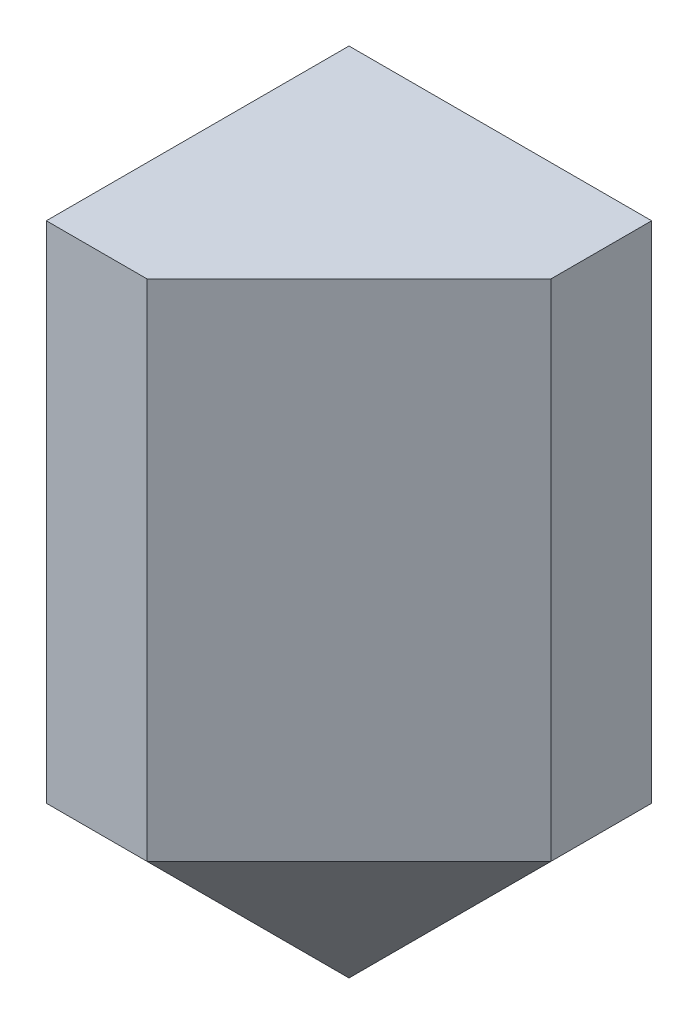
ISO-10303-21;
HEADER;
FILE_DESCRIPTION(('STEP AP214'),'2;1');
FILE_NAME('part.step','',(''),(''),'','','');
FILE_SCHEMA(('AUTOMOTIVE_DESIGN { 1 0 10303 214 1 1 1 1 }'));
ENDSEC;
DATA;
#1=APPLICATION_CONTEXT('core data for automotive mechanical design processes');
#2=APPLICATION_PROTOCOL_DEFINITION('international standard','automotive_design',2000,#1);
#3=PRODUCT_CONTEXT('',#1,'mechanical');
#4=PRODUCT('Part','Part','',(#3));
#5=PRODUCT_RELATED_PRODUCT_CATEGORY('part','',(#4));
#6=PRODUCT_DEFINITION_FORMATION('','',#4);
#7=PRODUCT_DEFINITION_CONTEXT('part definition',#1,'design');
#8=PRODUCT_DEFINITION('design','',#6,#7);
#9=PRODUCT_DEFINITION_SHAPE('','',#8);
#10=(LENGTH_UNIT() NAMED_UNIT(*) SI_UNIT(.MILLI.,.METRE.));
#11=(NAMED_UNIT(*) PLANE_ANGLE_UNIT() SI_UNIT($,.RADIAN.));
#12=(NAMED_UNIT(*) SI_UNIT($,.STERADIAN.) SOLID_ANGLE_UNIT());
#13=UNCERTAINTY_MEASURE_WITH_UNIT(LENGTH_MEASURE(1.E-05),#10,'distance_accuracy_value','');
#14=(GEOMETRIC_REPRESENTATION_CONTEXT(3) GLOBAL_UNCERTAINTY_ASSIGNED_CONTEXT((#13)) GLOBAL_UNIT_ASSIGNED_CONTEXT((#10,
#11,#12)) REPRESENTATION_CONTEXT('',''));
#15=CARTESIAN_POINT('',(0.,0.,0.));
#16=DIRECTION('',(0.,0.,1.));
#17=DIRECTION('',(1.,0.,0.));
#18=AXIS2_PLACEMENT_3D('',#15,#16,#17);
#19=CARTESIAN_POINT('',(0.,0.,30.));
#20=DIRECTION('',(1.,0.,0.));
#21=DIRECTION('',(0.,0.,-1.));
#22=AXIS2_PLACEMENT_3D('',#19,#20,#21);
#23=PLANE('',#22);
#24=CARTESIAN_POINT('',(0.,20.,14.));
#25=DIRECTION('',(-1.,0.,0.));
#26=DIRECTION('',(0.,0.,1.));
#27=AXIS2_PLACEMENT_3D('',#24,#25,#26);
#28=CIRCLE('',#27,2.75);
#29=CARTESIAN_POINT('',(0.,20.,16.75));
#30=VERTEX_POINT('',#29);
#31=EDGE_CURVE('E132',#30,#30,#28,.T.);
#32=ORIENTED_EDGE('',*,*,#31,.F.);
#33=EDGE_LOOP('',(#32));
#34=FACE_BOUND('',#33,.T.);
#35=CARTESIAN_POINT('',(0.,48.,14.));
#36=DIRECTION('',(-1.,0.,0.));
#37=DIRECTION('',(0.,0.,1.));
#38=AXIS2_PLACEMENT_3D('',#35,#36,#37);
#39=CIRCLE('',#38,2.75);
#40=CARTESIAN_POINT('',(0.,48.,16.75));
#41=VERTEX_POINT('',#40);
#42=EDGE_CURVE('E138',#41,#41,#39,.T.);
#43=ORIENTED_EDGE('',*,*,#42,.F.);
#44=EDGE_LOOP('',(#43));
#45=FACE_BOUND('',#44,.T.);
#46=DIRECTION('',(0.,0.,-1.));
#47=VECTOR('',#46,1.);
#48=CARTESIAN_POINT('',(0.,0.,30.));
#49=LINE('',#48,#47);
#50=CARTESIAN_POINT('',(0.,0.,9.99999999999995));
#51=VERTEX_POINT('',#50);
#52=CARTESIAN_POINT('',(0.,0.,0.));
#53=VERTEX_POINT('',#52);
#54=EDGE_CURVE('E163',#51,#53,#49,.T.);
#55=ORIENTED_EDGE('',*,*,#54,.F.);
#56=DIRECTION('',(0.,-0.707106781186546,-0.707106781186549));
#57=VECTOR('',#56,1.);
#58=CARTESIAN_POINT('',(0.,20.,30.));
#59=LINE('',#58,#57);
#60=CARTESIAN_POINT('',(0.,20.,30.));
#61=VERTEX_POINT('',#60);
#62=EDGE_CURVE('E11',#51,#61,#59,.F.);
#63=ORIENTED_EDGE('',*,*,#62,.T.);
#64=DIRECTION('',(0.,-1.,0.));
#65=VECTOR('',#64,1.);
#66=CARTESIAN_POINT('',(0.,0.,30.));
#67=LINE('',#66,#65);
#68=CARTESIAN_POINT('',(0.,70.,30.));
#69=VERTEX_POINT('',#68);
#70=EDGE_CURVE('E160',#69,#61,#67,.T.);
#71=ORIENTED_EDGE('',*,*,#70,.F.);
#72=DIRECTION('',(0.,0.,1.));
#73=VECTOR('',#72,1.);
#74=CARTESIAN_POINT('',(0.,70.,30.));
#75=LINE('',#74,#73);
#76=CARTESIAN_POINT('',(0.,70.,0.));
#77=VERTEX_POINT('',#76);
#78=EDGE_CURVE('E144',#77,#69,#75,.T.);
#79=ORIENTED_EDGE('',*,*,#78,.F.);
#80=DIRECTION('',(0.,-1.,0.));
#81=VECTOR('',#80,1.);
#82=CARTESIAN_POINT('',(0.,0.,0.));
#83=LINE('',#82,#81);
#84=EDGE_CURVE('E165',#77,#53,#83,.T.);
#85=ORIENTED_EDGE('',*,*,#84,.T.);
#86=EDGE_LOOP('',(#55,#63,#71,#79,#85));
#87=FACE_BOUND('',#86,.T.);
#88=ADVANCED_FACE('F39',(#34,#45,#87),#23,.F.);
#89=CARTESIAN_POINT('',(0.,0.,30.));
#90=DIRECTION('',(0.,1.,0.));
#91=DIRECTION('',(0.,0.,1.));
#92=AXIS2_PLACEMENT_3D('',#89,#90,#91);
#93=PLANE('',#92);
#94=DIRECTION('',(1.,0.,0.));
#95=VECTOR('',#94,1.);
#96=CARTESIAN_POINT('',(0.,0.,0.));
#97=LINE('',#96,#95);
#98=CARTESIAN_POINT('',(9.99999999999995,0.,0.));
#99=VERTEX_POINT('',#98);
#100=EDGE_CURVE('E168',#53,#99,#97,.T.);
#101=ORIENTED_EDGE('',*,*,#100,.T.);
#102=DIRECTION('',(0.,0.,1.));
#103=VECTOR('',#102,1.);
#104=CARTESIAN_POINT('',(9.99999999999995,0.,30.));
#105=LINE('',#104,#103);
#106=CARTESIAN_POINT('',(9.99999999999995,0.,9.99999999999995));
#107=VERTEX_POINT('',#106);
#108=EDGE_CURVE('E49',#99,#107,#105,.T.);
#109=ORIENTED_EDGE('',*,*,#108,.T.);
#110=DIRECTION('',(-1.,0.,0.));
#111=VECTOR('',#110,1.);
#112=CARTESIAN_POINT('',(0.,0.,9.99999999999995));
#113=LINE('',#112,#111);
#114=EDGE_CURVE('E60',#107,#51,#113,.T.);
#115=ORIENTED_EDGE('',*,*,#114,.T.);
#116=ORIENTED_EDGE('',*,*,#54,.T.);
#117=EDGE_LOOP('',(#101,#109,#115,#116));
#118=FACE_BOUND('',#117,.T.);
#119=ADVANCED_FACE('F221',(#118),#93,.F.);
#120=CARTESIAN_POINT('',(30.,0.,30.));
#121=DIRECTION('',(-1.,0.,0.));
#122=DIRECTION('',(0.,0.,1.));
#123=AXIS2_PLACEMENT_3D('',#120,#121,#122);
#124=PLANE('',#123);
#125=DIRECTION('',(0.,1.,0.));
#126=VECTOR('',#125,1.);
#127=CARTESIAN_POINT('',(30.,0.,0.));
#128=LINE('',#127,#126);
#129=CARTESIAN_POINT('',(30.,20.,0.));
#130=VERTEX_POINT('',#129);
#131=CARTESIAN_POINT('',(30.,70.,0.));
#132=VERTEX_POINT('',#131);
#133=EDGE_CURVE('E164',#130,#132,#128,.T.);
#134=ORIENTED_EDGE('',*,*,#133,.T.);
#135=DIRECTION('',(0.,0.,-1.));
#136=VECTOR('',#135,1.);
#137=CARTESIAN_POINT('',(30.,70.,0.));
#138=LINE('',#137,#136);
#139=CARTESIAN_POINT('',(30.,70.,9.99999999999992));
#140=VERTEX_POINT('',#139);
#141=EDGE_CURVE('E153',#140,#132,#138,.T.);
#142=ORIENTED_EDGE('',*,*,#141,.F.);
#143=DIRECTION('',(0.,-1.,0.));
#144=VECTOR('',#143,1.);
#145=CARTESIAN_POINT('',(30.,0.,9.99999999999995));
#146=LINE('',#145,#144);
#147=CARTESIAN_POINT('',(30.,20.,9.99999999999995));
#148=VERTEX_POINT('',#147);
#149=EDGE_CURVE('E178',#140,#148,#146,.T.);
#150=ORIENTED_EDGE('',*,*,#149,.T.);
#151=DIRECTION('',(0.,0.,-1.));
#152=VECTOR('',#151,1.);
#153=CARTESIAN_POINT('',(30.,20.,30.));
#154=LINE('',#153,#152);
#155=EDGE_CURVE('E176',#148,#130,#154,.T.);
#156=ORIENTED_EDGE('',*,*,#155,.T.);
#157=EDGE_LOOP('',(#134,#142,#150,#156));
#158=FACE_BOUND('',#157,.T.);
#159=ADVANCED_FACE('F227',(#158),#124,.F.);
#160=CARTESIAN_POINT('',(0.,0.,30.));
#161=DIRECTION('',(0.,0.,-1.));
#162=DIRECTION('',(-1.,0.,0.));
#163=AXIS2_PLACEMENT_3D('',#160,#161,#162);
#164=PLANE('',#163);
#165=DIRECTION('',(1.,0.,0.));
#166=VECTOR('',#165,1.);
#167=CARTESIAN_POINT('',(0.,20.,30.));
#168=LINE('',#167,#166);
#169=CARTESIAN_POINT('',(10.,20.,30.));
#170=VERTEX_POINT('',#169);
#171=EDGE_CURVE('E172',#61,#170,#168,.T.);
#172=ORIENTED_EDGE('',*,*,#171,.T.);
#173=DIRECTION('',(0.,1.,0.));
#174=VECTOR('',#173,1.);
#175=CARTESIAN_POINT('',(10.,0.,30.));
#176=LINE('',#175,#174);
#177=CARTESIAN_POINT('',(9.99999999999999,70.,30.));
#178=VERTEX_POINT('',#177);
#179=EDGE_CURVE('E174',#170,#178,#176,.T.);
#180=ORIENTED_EDGE('',*,*,#179,.T.);
#181=DIRECTION('',(1.,0.,0.));
#182=VECTOR('',#181,1.);
#183=CARTESIAN_POINT('',(9.99999999999999,70.,30.));
#184=LINE('',#183,#182);
#185=EDGE_CURVE('E147',#69,#178,#184,.T.);
#186=ORIENTED_EDGE('',*,*,#185,.F.);
#187=ORIENTED_EDGE('',*,*,#70,.T.);
#188=EDGE_LOOP('',(#172,#180,#186,#187));
#189=FACE_BOUND('',#188,.T.);
#190=ADVANCED_FACE('F201',(#189),#164,.F.);
#191=CARTESIAN_POINT('',(0.,0.,0.));
#192=DIRECTION('',(0.,0.,-1.));
#193=DIRECTION('',(-1.,0.,0.));
#194=AXIS2_PLACEMENT_3D('',#191,#192,#193);
#195=PLANE('',#194);
#196=CARTESIAN_POINT('',(15.,55.,0.));
#197=DIRECTION('',(0.,0.,-1.));
#198=DIRECTION('',(-1.,0.,0.));
#199=AXIS2_PLACEMENT_3D('',#196,#197,#198);
#200=CIRCLE('',#199,7.5);
#201=CARTESIAN_POINT('',(7.5,55.,0.));
#202=VERTEX_POINT('',#201);
#203=EDGE_CURVE('E115',#202,#202,#200,.T.);
#204=ORIENTED_EDGE('',*,*,#203,.F.);
#205=EDGE_LOOP('',(#204));
#206=FACE_BOUND('',#205,.T.);
#207=CARTESIAN_POINT('',(18.,20.,0.));
#208=DIRECTION('',(0.,0.,-1.));
#209=DIRECTION('',(-1.,0.,0.));
#210=AXIS2_PLACEMENT_3D('',#207,#208,#209);
#211=CIRCLE('',#210,2.74999999999999);
#212=CARTESIAN_POINT('',(15.25,20.,0.));
#213=VERTEX_POINT('',#212);
#214=EDGE_CURVE('E125',#213,#213,#211,.T.);
#215=ORIENTED_EDGE('',*,*,#214,.F.);
#216=EDGE_LOOP('',(#215));
#217=FACE_BOUND('',#216,.T.);
#218=ORIENTED_EDGE('',*,*,#133,.F.);
#219=DIRECTION('',(0.707106781186549,0.707106781186546,0.));
#220=VECTOR('',#219,1.);
#221=CARTESIAN_POINT('',(4.99999999999996,-4.99999999999997,0.));
#222=LINE('',#221,#220);
#223=EDGE_CURVE('E180',#130,#99,#222,.F.);
#224=ORIENTED_EDGE('',*,*,#223,.T.);
#225=ORIENTED_EDGE('',*,*,#100,.F.);
#226=ORIENTED_EDGE('',*,*,#84,.F.);
#227=DIRECTION('',(-1.,0.,0.));
#228=VECTOR('',#227,1.);
#229=CARTESIAN_POINT('',(0.,70.,0.));
#230=LINE('',#229,#228);
#231=EDGE_CURVE('E156',#132,#77,#230,.T.);
#232=ORIENTED_EDGE('',*,*,#231,.F.);
#233=EDGE_LOOP('',(#218,#224,#225,#226,#232));
#234=FACE_BOUND('',#233,.T.);
#235=ADVANCED_FACE('F218',(#206,#217,#234),#195,.T.);
#236=CARTESIAN_POINT('',(30.,20.,30.));
#237=DIRECTION('',(-0.707106781186546,0.707106781186549,0.));
#238=DIRECTION('',(0.,0.,-1.));
#239=AXIS2_PLACEMENT_3D('',#236,#237,#238);
#240=PLANE('',#239);
#241=ORIENTED_EDGE('',*,*,#223,.F.);
#242=ORIENTED_EDGE('',*,*,#155,.F.);
#243=DIRECTION('',(-0.707106781186549,-0.707106781186546,0.));
#244=VECTOR('',#243,1.);
#245=CARTESIAN_POINT('',(30.,20.,9.99999999999995));
#246=LINE('',#245,#244);
#247=EDGE_CURVE('E44',#107,#148,#246,.F.);
#248=ORIENTED_EDGE('',*,*,#247,.F.);
#249=ORIENTED_EDGE('',*,*,#108,.F.);
#250=EDGE_LOOP('',(#241,#242,#248,#249));
#251=FACE_BOUND('',#250,.T.);
#252=ADVANCED_FACE('F42',(#251),#240,.F.);
#253=CARTESIAN_POINT('',(0.,20.,30.));
#254=DIRECTION('',(0.,0.707106781186549,-0.707106781186546));
#255=DIRECTION('',(1.,0.,0.));
#256=AXIS2_PLACEMENT_3D('',#253,#254,#255);
#257=PLANE('',#256);
#258=ORIENTED_EDGE('',*,*,#62,.F.);
#259=ORIENTED_EDGE('',*,*,#114,.F.);
#260=DIRECTION('',(0.,0.707106781186546,0.707106781186549));
#261=VECTOR('',#260,1.);
#262=CARTESIAN_POINT('',(9.99999999999998,10.,20.));
#263=LINE('',#262,#261);
#264=EDGE_CURVE('E185',#170,#107,#263,.F.);
#265=ORIENTED_EDGE('',*,*,#264,.F.);
#266=ORIENTED_EDGE('',*,*,#171,.F.);
#267=EDGE_LOOP('',(#258,#259,#265,#266));
#268=FACE_BOUND('',#267,.T.);
#269=ADVANCED_FACE('F211',(#268),#257,.F.);
#270=CARTESIAN_POINT('',(30.,20.,9.99999999999995));
#271=DIRECTION('',(0.577350269189626,-0.577350269189628,0.577350269189624));
#272=DIRECTION('',(0.707106781186549,0.707106781186546,0.));
#273=AXIS2_PLACEMENT_3D('',#270,#271,#272);
#274=PLANE('',#273);
#275=ORIENTED_EDGE('',*,*,#264,.T.);
#276=ORIENTED_EDGE('',*,*,#247,.T.);
#277=DIRECTION('',(0.707106781186546,0.,-0.707106781186549));
#278=VECTOR('',#277,1.);
#279=CARTESIAN_POINT('',(30.,20.,9.99999999999995));
#280=LINE('',#279,#278);
#281=EDGE_CURVE('E159',#170,#148,#280,.T.);
#282=ORIENTED_EDGE('',*,*,#281,.F.);
#283=EDGE_LOOP('',(#275,#276,#282));
#284=FACE_BOUND('',#283,.T.);
#285=ADVANCED_FACE('F192',(#284),#274,.T.);
#286=CARTESIAN_POINT('',(10.,0.,30.));
#287=DIRECTION('',(-0.707106781186549,0.,-0.707106781186546));
#288=DIRECTION('',(0.,1.,0.));
#289=AXIS2_PLACEMENT_3D('',#286,#287,#288);
#290=PLANE('',#289);
#291=ORIENTED_EDGE('',*,*,#281,.T.);
#292=ORIENTED_EDGE('',*,*,#149,.F.);
#293=DIRECTION('',(0.707106781186546,0.,-0.707106781186549));
#294=VECTOR('',#293,1.);
#295=CARTESIAN_POINT('',(30.,70.,9.99999999999992));
#296=LINE('',#295,#294);
#297=EDGE_CURVE('E150',#178,#140,#296,.T.);
#298=ORIENTED_EDGE('',*,*,#297,.F.);
#299=ORIENTED_EDGE('',*,*,#179,.F.);
#300=EDGE_LOOP('',(#291,#292,#298,#299));
#301=FACE_BOUND('',#300,.T.);
#302=ADVANCED_FACE('F197',(#301),#290,.F.);
#303=CARTESIAN_POINT('',(0.,70.,0.));
#304=DIRECTION('',(0.,-1.,0.));
#305=DIRECTION('',(0.,0.,-1.));
#306=AXIS2_PLACEMENT_3D('',#303,#304,#305);
#307=PLANE('',#306);
#308=ORIENTED_EDGE('',*,*,#78,.T.);
#309=ORIENTED_EDGE('',*,*,#185,.T.);
#310=ORIENTED_EDGE('',*,*,#297,.T.);
#311=ORIENTED_EDGE('',*,*,#141,.T.);
#312=ORIENTED_EDGE('',*,*,#231,.T.);
#313=EDGE_LOOP('',(#308,#309,#310,#311,#312));
#314=FACE_BOUND('',#313,.T.);
#315=ADVANCED_FACE('F204',(#314),#307,.F.);
#316=CARTESIAN_POINT('',(13.,48.,14.));
#317=DIRECTION('',(-1.,0.,0.));
#318=DIRECTION('',(0.,0.,1.));
#319=AXIS2_PLACEMENT_3D('',#316,#317,#318);
#320=CONICAL_SURFACE('',#319,2.75,1.02974425867665);
#321=CARTESIAN_POINT('',(14.6523667023258,48.,14.));
#322=VERTEX_POINT('',#321);
#323=VERTEX_LOOP('',#322);
#324=FACE_BOUND('',#323,.T.);
#325=CARTESIAN_POINT('',(13.,48.,14.));
#326=DIRECTION('',(-1.,0.,0.));
#327=DIRECTION('',(0.,0.,1.));
#328=AXIS2_PLACEMENT_3D('',#325,#326,#327);
#329=CIRCLE('',#328,2.75);
#330=CARTESIAN_POINT('',(13.,48.,16.75));
#331=VERTEX_POINT('',#330);
#332=EDGE_CURVE('E141',#331,#331,#329,.T.);
#333=ORIENTED_EDGE('',*,*,#332,.T.);
#334=EDGE_LOOP('',(#333));
#335=FACE_BOUND('',#334,.T.);
#336=ADVANCED_FACE('F247',(#324,#335),#320,.F.);
#337=CARTESIAN_POINT('',(0.,48.,14.));
#338=DIRECTION('',(-1.,0.,0.));
#339=DIRECTION('',(0.,0.,1.));
#340=AXIS2_PLACEMENT_3D('',#337,#338,#339);
#341=CYLINDRICAL_SURFACE('',#340,2.75);
#342=ORIENTED_EDGE('',*,*,#332,.F.);
#343=EDGE_LOOP('',(#342));
#344=FACE_BOUND('',#343,.T.);
#345=ORIENTED_EDGE('',*,*,#42,.T.);
#346=EDGE_LOOP('',(#345));
#347=FACE_BOUND('',#346,.T.);
#348=ADVANCED_FACE('F252',(#344,#347),#341,.F.);
#349=CARTESIAN_POINT('',(13.,20.,14.));
#350=DIRECTION('',(-1.,0.,0.));
#351=DIRECTION('',(0.,0.,1.));
#352=AXIS2_PLACEMENT_3D('',#349,#350,#351);
#353=CONICAL_SURFACE('',#352,2.75,1.02974425867665);
#354=CARTESIAN_POINT('',(14.6523667023258,20.,14.));
#355=VERTEX_POINT('',#354);
#356=VERTEX_LOOP('',#355);
#357=FACE_BOUND('',#356,.T.);
#358=CARTESIAN_POINT('',(13.,20.,14.));
#359=DIRECTION('',(-1.,0.,0.));
#360=DIRECTION('',(0.,0.,1.));
#361=AXIS2_PLACEMENT_3D('',#358,#359,#360);
#362=CIRCLE('',#361,2.75);
#363=CARTESIAN_POINT('',(13.,20.,16.75));
#364=VERTEX_POINT('',#363);
#365=EDGE_CURVE('E135',#364,#364,#362,.T.);
#366=ORIENTED_EDGE('',*,*,#365,.T.);
#367=EDGE_LOOP('',(#366));
#368=FACE_BOUND('',#367,.T.);
#369=ADVANCED_FACE('F364',(#357,#368),#353,.F.);
#370=CARTESIAN_POINT('',(0.,20.,14.));
#371=DIRECTION('',(-1.,0.,0.));
#372=DIRECTION('',(0.,0.,1.));
#373=AXIS2_PLACEMENT_3D('',#370,#371,#372);
#374=CYLINDRICAL_SURFACE('',#373,2.75);
#375=ORIENTED_EDGE('',*,*,#365,.F.);
#376=EDGE_LOOP('',(#375));
#377=FACE_BOUND('',#376,.T.);
#378=ORIENTED_EDGE('',*,*,#31,.T.);
#379=EDGE_LOOP('',(#378));
#380=FACE_BOUND('',#379,.T.);
#381=ADVANCED_FACE('F374',(#377,#380),#374,.F.);
#382=CARTESIAN_POINT('',(18.,20.,13.));
#383=DIRECTION('',(0.,0.,-1.));
#384=DIRECTION('',(-1.,0.,0.));
#385=AXIS2_PLACEMENT_3D('',#382,#383,#384);
#386=CONICAL_SURFACE('',#385,2.75,1.02974425867665);
#387=CARTESIAN_POINT('',(18.,20.,14.6523667023258));
#388=VERTEX_POINT('',#387);
#389=VERTEX_LOOP('',#388);
#390=FACE_BOUND('',#389,.T.);
#391=CARTESIAN_POINT('',(18.,20.,13.));
#392=DIRECTION('',(0.,0.,-1.));
#393=DIRECTION('',(-1.,0.,0.));
#394=AXIS2_PLACEMENT_3D('',#391,#392,#393);
#395=CIRCLE('',#394,2.75);
#396=CARTESIAN_POINT('',(15.25,20.,13.));
#397=VERTEX_POINT('',#396);
#398=EDGE_CURVE('E129',#397,#397,#395,.T.);
#399=ORIENTED_EDGE('',*,*,#398,.T.);
#400=EDGE_LOOP('',(#399));
#401=FACE_BOUND('',#400,.T.);
#402=ADVANCED_FACE('F385',(#390,#401),#386,.F.);
#403=CARTESIAN_POINT('',(18.,20.,0.));
#404=DIRECTION('',(0.,0.,-1.));
#405=DIRECTION('',(-1.,0.,0.));
#406=AXIS2_PLACEMENT_3D('',#403,#404,#405);
#407=CYLINDRICAL_SURFACE('',#406,2.74999999999999);
#408=ORIENTED_EDGE('',*,*,#398,.F.);
#409=EDGE_LOOP('',(#408));
#410=FACE_BOUND('',#409,.T.);
#411=ORIENTED_EDGE('',*,*,#214,.T.);
#412=EDGE_LOOP('',(#411));
#413=FACE_BOUND('',#412,.T.);
#414=ADVANCED_FACE('F395',(#410,#413),#407,.F.);
#415=CARTESIAN_POINT('',(15.,55.,3.));
#416=DIRECTION('',(0.,0.,-1.));
#417=DIRECTION('',(-1.,0.,0.));
#418=AXIS2_PLACEMENT_3D('',#415,#416,#417);
#419=CYLINDRICAL_SURFACE('',#418,7.5);
#420=CARTESIAN_POINT('',(15.,55.,3.));
#421=DIRECTION('',(0.,0.,-1.));
#422=DIRECTION('',(-1.,0.,0.));
#423=AXIS2_PLACEMENT_3D('',#420,#421,#422);
#424=CIRCLE('',#423,7.5);
#425=CARTESIAN_POINT('',(7.5,55.,3.));
#426=VERTEX_POINT('',#425);
#427=EDGE_CURVE('E119',#426,#426,#424,.T.);
#428=ORIENTED_EDGE('',*,*,#427,.F.);
#429=EDGE_LOOP('',(#428));
#430=FACE_BOUND('',#429,.T.);
#431=ORIENTED_EDGE('',*,*,#203,.T.);
#432=EDGE_LOOP('',(#431));
#433=FACE_BOUND('',#432,.T.);
#434=ADVANCED_FACE('F405',(#430,#433),#419,.F.);
#435=CARTESIAN_POINT('',(15.,55.,3.));
#436=DIRECTION('',(0.,0.,-1.));
#437=DIRECTION('',(-1.,0.,0.));
#438=AXIS2_PLACEMENT_3D('',#435,#436,#437);
#439=PLANE('',#438);
#440=CARTESIAN_POINT('',(15.,55.,3.));
#441=DIRECTION('',(0.,0.,-1.));
#442=DIRECTION('',(-1.,0.,0.));
#443=AXIS2_PLACEMENT_3D('',#440,#441,#442);
#444=CIRCLE('',#443,2.25);
#445=CARTESIAN_POINT('',(12.75,55.,3.));
#446=VERTEX_POINT('',#445);
#447=EDGE_CURVE('E116',#446,#446,#444,.T.);
#448=ORIENTED_EDGE('',*,*,#447,.F.);
#449=EDGE_LOOP('',(#448));
#450=FACE_BOUND('',#449,.T.);
#451=ORIENTED_EDGE('',*,*,#427,.T.);
#452=EDGE_LOOP('',(#451));
#453=FACE_BOUND('',#452,.T.);
#454=ADVANCED_FACE('F109',(#450,#453),#439,.T.);
#455=CARTESIAN_POINT('',(15.,55.,13.));
#456=DIRECTION('',(0.,0.,-1.));
#457=DIRECTION('',(-1.,0.,0.));
#458=AXIS2_PLACEMENT_3D('',#455,#456,#457);
#459=CONICAL_SURFACE('',#458,2.25,1.02974425867665);
#460=CARTESIAN_POINT('',(15.,55.,14.351936392812));
#461=VERTEX_POINT('',#460);
#462=VERTEX_LOOP('',#461);
#463=FACE_BOUND('',#462,.T.);
#464=CARTESIAN_POINT('',(15.,55.,13.));
#465=DIRECTION('',(0.,0.,-1.));
#466=DIRECTION('',(-1.,0.,0.));
#467=AXIS2_PLACEMENT_3D('',#464,#465,#466);
#468=CIRCLE('',#467,2.25);
#469=CARTESIAN_POINT('',(12.75,55.,13.));
#470=VERTEX_POINT('',#469);
#471=EDGE_CURVE('E113',#470,#470,#468,.T.);
#472=ORIENTED_EDGE('',*,*,#471,.T.);
#473=EDGE_LOOP('',(#472));
#474=FACE_BOUND('',#473,.T.);
#475=ADVANCED_FACE('F105',(#463,#474),#459,.F.);
#476=CARTESIAN_POINT('',(15.,55.,3.));
#477=DIRECTION('',(0.,0.,-1.));
#478=DIRECTION('',(-1.,0.,0.));
#479=AXIS2_PLACEMENT_3D('',#476,#477,#478);
#480=CYLINDRICAL_SURFACE('',#479,2.25);
#481=ORIENTED_EDGE('',*,*,#471,.F.);
#482=EDGE_LOOP('',(#481));
#483=FACE_BOUND('',#482,.T.);
#484=ORIENTED_EDGE('',*,*,#447,.T.);
#485=EDGE_LOOP('',(#484));
#486=FACE_BOUND('',#485,.T.);
#487=ADVANCED_FACE('F108',(#483,#486),#480,.F.);
#488=CLOSED_SHELL('',(#88,#119,#159,#190,#235,#252,#269,#285,#302,#315,#336,#348,#369,#381,#402,
#414,#434,#454,#475,#487));
#489=MANIFOLD_SOLID_BREP('B2',#488);
#490=ADVANCED_BREP_SHAPE_REPRESENTATION('',(#18,#489),#14);
#491=SHAPE_DEFINITION_REPRESENTATION(#9,#490);
ENDSEC;
END-ISO-10303-21;
